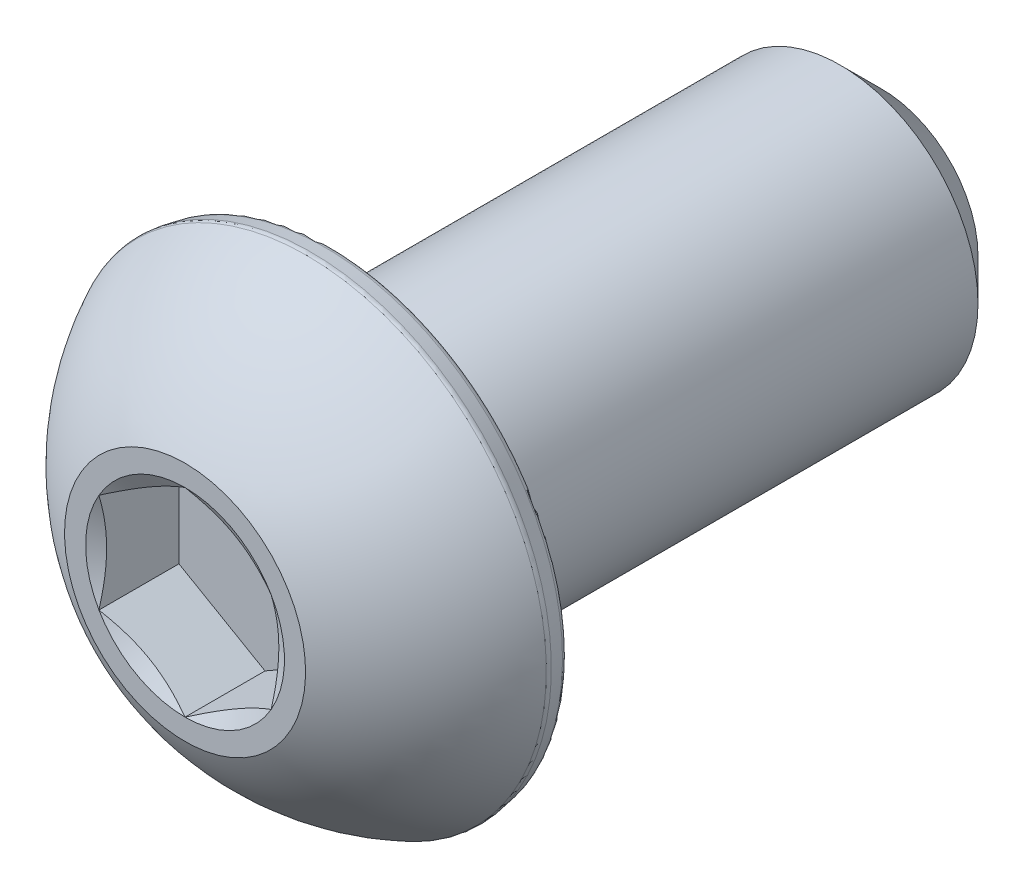
ISO-10303-21;
HEADER;
FILE_DESCRIPTION(('STEP AP214'),'2;1');
FILE_NAME('part.step','',(''),(''),'','','');
FILE_SCHEMA(('AUTOMOTIVE_DESIGN { 1 0 10303 214 1 1 1 1 }'));
ENDSEC;
DATA;
#1=APPLICATION_CONTEXT('core data for automotive mechanical design processes');
#2=APPLICATION_PROTOCOL_DEFINITION('international standard','automotive_design',2000,#1);
#3=PRODUCT_CONTEXT('',#1,'mechanical');
#4=PRODUCT('Part','Part','',(#3));
#5=PRODUCT_RELATED_PRODUCT_CATEGORY('part','',(#4));
#6=PRODUCT_DEFINITION_FORMATION('','',#4);
#7=PRODUCT_DEFINITION_CONTEXT('part definition',#1,'design');
#8=PRODUCT_DEFINITION('design','',#6,#7);
#9=PRODUCT_DEFINITION_SHAPE('','',#8);
#10=(LENGTH_UNIT() NAMED_UNIT(*) SI_UNIT(.MILLI.,.METRE.));
#11=(NAMED_UNIT(*) PLANE_ANGLE_UNIT() SI_UNIT($,.RADIAN.));
#12=(NAMED_UNIT(*) SI_UNIT($,.STERADIAN.) SOLID_ANGLE_UNIT());
#13=UNCERTAINTY_MEASURE_WITH_UNIT(LENGTH_MEASURE(1.E-05),#10,'distance_accuracy_value','');
#14=(GEOMETRIC_REPRESENTATION_CONTEXT(3) GLOBAL_UNCERTAINTY_ASSIGNED_CONTEXT((#13)) GLOBAL_UNIT_ASSIGNED_CONTEXT((#10,
#11,#12)) REPRESENTATION_CONTEXT('',''));
#15=CARTESIAN_POINT('',(0.,0.,0.));
#16=DIRECTION('',(0.,0.,1.));
#17=DIRECTION('',(1.,0.,0.));
#18=AXIS2_PLACEMENT_3D('',#15,#16,#17);
#19=CARTESIAN_POINT('',(0.,0.,8.0264));
#20=DIRECTION('',(0.,0.,-1.));
#21=DIRECTION('',(-1.,0.,0.));
#22=AXIS2_PLACEMENT_3D('',#19,#20,#21);
#23=PLANE('',#22);
#24=CARTESIAN_POINT('',(0.,0.,8.0264));
#25=DIRECTION('',(0.,0.,1.));
#26=DIRECTION('',(1.,0.,0.));
#27=AXIS2_PLACEMENT_3D('',#24,#25,#26);
#28=CIRCLE('',#27,2.29135888084633);
#29=CARTESIAN_POINT('',(-1.984375,1.14567944042316,8.0264));
#30=VERTEX_POINT('',#29);
#31=CARTESIAN_POINT('',(-1.984375,-1.14567944042316,8.0264));
#32=VERTEX_POINT('',#31);
#33=EDGE_CURVE('E91',#30,#32,#28,.T.);
#34=ORIENTED_EDGE('',*,*,#33,.F.);
#35=CARTESIAN_POINT('',(0.,2.29135888084633,8.0264));
#36=VERTEX_POINT('',#35);
#37=EDGE_CURVE('E99',#36,#30,#28,.T.);
#38=ORIENTED_EDGE('',*,*,#37,.F.);
#39=CARTESIAN_POINT('',(1.984375,1.14567944042316,8.0264));
#40=VERTEX_POINT('',#39);
#41=EDGE_CURVE('E51',#40,#36,#28,.T.);
#42=ORIENTED_EDGE('',*,*,#41,.F.);
#43=CARTESIAN_POINT('',(1.984375,-1.14567944042316,8.0264));
#44=VERTEX_POINT('',#43);
#45=EDGE_CURVE('E59',#44,#40,#28,.T.);
#46=ORIENTED_EDGE('',*,*,#45,.F.);
#47=CARTESIAN_POINT('',(0.,-2.29135888084633,8.0264));
#48=VERTEX_POINT('',#47);
#49=EDGE_CURVE('E133',#48,#44,#28,.T.);
#50=ORIENTED_EDGE('',*,*,#49,.F.);
#51=EDGE_CURVE('E103',#32,#48,#28,.T.);
#52=ORIENTED_EDGE('',*,*,#51,.F.);
#53=EDGE_LOOP('',(#34,#38,#42,#46,#50,#52));
#54=FACE_BOUND('',#53,.T.);
#55=CARTESIAN_POINT('',(0.,0.,8.0264));
#56=DIRECTION('',(0.,0.,1.));
#57=DIRECTION('',(1.,0.,0.));
#58=AXIS2_PLACEMENT_3D('',#55,#56,#57);
#59=CIRCLE('',#58,2.778125);
#60=CARTESIAN_POINT('',(0.,2.778125,8.0264));
#61=VERTEX_POINT('',#60);
#62=EDGE_CURVE('E115',#61,#61,#59,.T.);
#63=ORIENTED_EDGE('',*,*,#62,.T.);
#64=EDGE_LOOP('',(#63));
#65=FACE_BOUND('',#64,.T.);
#66=ADVANCED_FACE('F40',(#54,#65),#23,.F.);
#67=CARTESIAN_POINT('',(0.,0.,2.55156816343582));
#68=DIRECTION('',(0.,0.,1.));
#69=DIRECTION('',(0.,1.,0.));
#70=AXIS2_PLACEMENT_3D('',#67,#68,#69);
#71=SPHERICAL_SURFACE('',#70,6.13936170577053);
#72=CARTESIAN_POINT('',(0.,0.,5.22569876785228));
#73=DIRECTION('',(0.,0.,-1.));
#74=DIRECTION('',(-1.,0.,0.));
#75=AXIS2_PLACEMENT_3D('',#72,#73,#74);
#76=CIRCLE('',#75,5.52637201650458);
#77=CARTESIAN_POINT('',(0.,5.52637201650459,5.22569876785228));
#78=VERTEX_POINT('',#77);
#79=EDGE_CURVE('E111',#78,#78,#76,.F.);
#80=CARTESIAN_POINT('',(0.,5.52637201650459,5.22569876785228));
#81=CARTESIAN_POINT('',(0.,5.50825080177498,5.26314830718222));
#82=CARTESIAN_POINT('',(0.,5.48974881162673,5.30041359240028));
#83=CARTESIAN_POINT('',(0.,5.45199117255904,5.37456037887531));
#84=CARTESIAN_POINT('',(0.,5.4327355236396,5.41144188013228));
#85=CARTESIAN_POINT('',(0.,5.3934784590956,5.4848058229478));
#86=CARTESIAN_POINT('',(0.,5.37347704347105,5.52128826450635));
#87=CARTESIAN_POINT('',(0.,5.3327367292478,5.59383901960831));
#88=CARTESIAN_POINT('',(0.,5.3119978306491,5.62990733315172));
#89=CARTESIAN_POINT('',(0.,5.26979111662966,5.70161492366804));
#90=CARTESIAN_POINT('',(0.,5.24832330120893,5.73725420064096));
#91=CARTESIAN_POINT('',(0.,5.20466762693298,5.80808898982251));
#92=CARTESIAN_POINT('',(0.,5.18247976807777,5.84328450203115));
#93=CARTESIAN_POINT('',(0.,5.13739317629116,5.91321721606987));
#94=CARTESIAN_POINT('',(0.,5.11449444335976,5.94795441789995));
#95=CARTESIAN_POINT('',(0.,5.06799556699607,6.01695615519478));
#96=CARTESIAN_POINT('',(0.,5.04439542356378,6.05122069065953));
#97=CARTESIAN_POINT('',(0.,4.9965034795341,6.11926293451963));
#98=CARTESIAN_POINT('',(0.,4.9722116789367,6.15304064291498));
#99=CARTESIAN_POINT('',(0.,4.92294645978839,6.22009527314162));
#100=CARTESIAN_POINT('',(0.,4.89797304123748,6.25337219497291));
#101=CARTESIAN_POINT('',(0.,4.84735490708144,6.31941149953536));
#102=CARTESIAN_POINT('',(0.,4.82171019147631,6.35217388226653));
#103=CARTESIAN_POINT('',(0.,4.76976006154395,6.41717056874016));
#104=CARTESIAN_POINT('',(0.,4.74345464721672,6.44940487248263));
#105=CARTESIAN_POINT('',(0.,4.69019399122223,6.5133320793321));
#106=CARTESIAN_POINT('',(0.,4.66323874955498,6.5450249824391));
#107=CARTESIAN_POINT('',(0.,4.60868957882039,6.60785629011853));
#108=CARTESIAN_POINT('',(0.,4.58109564975306,6.63899469469096));
#109=CARTESIAN_POINT('',(0.,4.52528050811203,6.70070413656277));
#110=CARTESIAN_POINT('',(0.,4.49705929553834,6.73127517386215));
#111=CARTESIAN_POINT('',(0.,4.44000125001922,6.79183724692836));
#112=CARTESIAN_POINT('',(0.,4.41116441707378,6.82182828269518));
#113=CARTESIAN_POINT('',(0.,4.35288704836658,6.88121795813715));
#114=CARTESIAN_POINT('',(0.,4.32344651260481,6.91061659781231));
#115=CARTESIAN_POINT('',(0.,4.2639739053159,6.96880933133461));
#116=CARTESIAN_POINT('',(0.,4.23394183378876,6.99760342518176));
#117=CARTESIAN_POINT('',(0.,4.17329856648729,7.05457516715566));
#118=CARTESIAN_POINT('',(0.,4.14268737071296,7.08275281528242));
#119=CARTESIAN_POINT('',(0.,4.08089850577313,7.13848002068504));
#120=CARTESIAN_POINT('',(0.,4.04972083660764,7.16602957796091));
#121=CARTESIAN_POINT('',(0.,3.98681190985103,7.22048921610578));
#122=CARTESIAN_POINT('',(0.,3.95508065225992,7.24739929697477));
#123=CARTESIAN_POINT('',(0.,3.89107766240224,7.30056886102995));
#124=CARTESIAN_POINT('',(0.,3.85880593013566,7.32682834421614));
#125=CARTESIAN_POINT('',(0.,3.79373532804181,7.37868586050525));
#126=CARTESIAN_POINT('',(0.,3.76093645821453,7.40428389360817));
#127=CARTESIAN_POINT('',(0.,3.69482513596822,7.45480793069356));
#128=CARTESIAN_POINT('',(0.,3.66151268354918,7.47973393467603));
#129=CARTESIAN_POINT('',(0.,3.59438796333499,7.5289036122083));
#130=CARTESIAN_POINT('',(0.,3.56057569553984,7.55314728575809));
#131=CARTESIAN_POINT('',(0.,3.49246531836684,7.60094228313378));
#132=CARTESIAN_POINT('',(0.,3.45816720898899,7.62449360695967));
#133=CARTESIAN_POINT('',(0.,3.3890993231695,7.67089417161335));
#134=CARTESIAN_POINT('',(0.,3.35432954672787,7.69374341244114));
#135=CARTESIAN_POINT('',(0.,3.28433269645534,7.73873036840404));
#136=CARTESIAN_POINT('',(0.,3.24910562262445,7.76086808353916));
#137=CARTESIAN_POINT('',(0.,3.17820873538992,7.80442283788848));
#138=CARTESIAN_POINT('',(0.,3.14253892198629,7.82583987710268));
#139=CARTESIAN_POINT('',(0.,3.0707712995602,7.86794443315283));
#140=CARTESIAN_POINT('',(0.,3.03467349053775,7.88863194998878));
#141=CARTESIAN_POINT('',(0.,2.96206478589977,7.92926889417562));
#142=CARTESIAN_POINT('',(0.,2.92555389028424,7.94921832152651));
#143=CARTESIAN_POINT('',(0.,2.85213413627351,7.98837090731014));
#144=CARTESIAN_POINT('',(0.,2.81522527787832,8.00757406574288));
#145=CARTESIAN_POINT('',(0.,2.778125,8.0264));
#146=B_SPLINE_CURVE_WITH_KNOTS('',3,(#80,#81,#82,#83,#84,#85,#86,#87,#88,#89,#90,#91,#92,#93,
#94,#95,#96,#97,#98,#99,#100,#101,#102,#103,#104,#105,#106,#107,#108,#109,#110,#111,#112,#113,
#114,#115,#116,#117,#118,#119,#120,#121,#122,#123,#124,#125,#126,#127,#128,#129,#130,#131,#132,
#133,#134,#135,#136,#137,#138,#139,#140,#141,#142,#143,#144,#145),.UNSPECIFIED.,.F.,.F.,(4,2,2,
2,2,2,2,2,2,2,2,2,2,2,2,2,2,2,2,2,2,2,2,2,2,2,2,2,2,2,2,2,4),(0.,0.124808174209304,
0.249616348418608,0.374424522627912,0.499232696837217,0.624040871046521,0.748849045255825,
0.873657219465129,0.998465393674433,1.12327356788374,1.24808174209304,1.37288991630235,
1.49769809051165,1.62250626472095,1.74731443893026,1.87212261313956,1.99693078734887,
2.12173896155817,2.24654713576747,2.37135530997678,2.49616348418608,2.62097165839539,
2.74577983260469,2.870588006814,2.9953961810233,3.1202043552326,3.24501252944191,
3.36982070365121,3.49462887786052,3.61943705206982,3.74424522627913,3.86905340048843,
3.99386157469773),.UNSPECIFIED.);
#147=EDGE_CURVE('BSEAM207',#78,#61,#146,.T.);
#148=ORIENTED_EDGE('',*,*,#79,.T.);
#149=ORIENTED_EDGE('',*,*,#62,.F.);
#150=ORIENTED_EDGE('',*,*,#147,.T.);
#151=ORIENTED_EDGE('',*,*,#147,.F.);
#152=EDGE_LOOP('',(#148,#150,#149,#151));
#153=FACE_BOUND('',#152,.T.);
#154=ADVANCED_FACE('F207',(#153),#71,.T.);
#155=CARTESIAN_POINT('',(0.,0.,4.6736));
#156=DIRECTION('',(0.,0.,1.));
#157=DIRECTION('',(1.,0.,0.));
#158=AXIS2_PLACEMENT_3D('',#155,#156,#157);
#159=CONICAL_SURFACE('',#158,5.4612216348621,0.174532925199434);
#160=CARTESIAN_POINT('',(0.,0.,5.12356919154108));
#161=DIRECTION('',(0.,0.,-1.));
#162=DIRECTION('',(-1.,0.,0.));
#163=AXIS2_PLACEMENT_3D('',#160,#161,#162);
#164=CIRCLE('',#163,5.54056334381837);
#165=CARTESIAN_POINT('',(-5.54056334381837,0.,5.12356919154108));
#166=VERTEX_POINT('',#165);
#167=EDGE_CURVE('E44',#166,#166,#164,.T.);
#168=ORIENTED_EDGE('',*,*,#167,.T.);
#169=EDGE_LOOP('',(#168));
#170=FACE_BOUND('',#169,.T.);
#171=CARTESIAN_POINT('',(0.,0.,4.81212961949592));
#172=DIRECTION('',(0.,0.,-1.));
#173=DIRECTION('',(-1.,0.,0.));
#174=AXIS2_PLACEMENT_3D('',#171,#172,#173);
#175=CIRCLE('',#174,5.48564814440651);
#176=CARTESIAN_POINT('',(-5.48564814440651,0.,4.81212961949592));
#177=VERTEX_POINT('',#176);
#178=EDGE_CURVE('E233',#177,#177,#175,.F.);
#179=ORIENTED_EDGE('',*,*,#178,.T.);
#180=EDGE_LOOP('',(#179));
#181=FACE_BOUND('',#180,.T.);
#182=ADVANCED_FACE('F214',(#170,#181),#159,.T.);
#183=CARTESIAN_POINT('',(0.,5.4612216348621,4.6736));
#184=DIRECTION('',(0.,0.,1.));
#185=DIRECTION('',(1.,0.,0.));
#186=AXIS2_PLACEMENT_3D('',#183,#184,#185);
#187=PLANE('',#186);
#188=CARTESIAN_POINT('',(0.,0.,4.6736));
#189=DIRECTION('',(0.,0.,1.));
#190=DIRECTION('',(1.,0.,0.));
#191=AXIS2_PLACEMENT_3D('',#188,#189,#190);
#192=CIRCLE('',#191,5.32055497269154);
#193=CARTESIAN_POINT('',(5.32055497269154,0.,4.6736));
#194=VERTEX_POINT('',#193);
#195=EDGE_CURVE('E11',#194,#194,#192,.F.);
#196=ORIENTED_EDGE('',*,*,#195,.T.);
#197=EDGE_LOOP('',(#196));
#198=FACE_BOUND('',#197,.T.);
#199=CARTESIAN_POINT('',(0.,0.,4.6736));
#200=DIRECTION('',(0.,0.,1.));
#201=DIRECTION('',(1.,0.,0.));
#202=AXIS2_PLACEMENT_3D('',#199,#200,#201);
#203=CIRCLE('',#202,3.175);
#204=CARTESIAN_POINT('',(3.175,0.,4.6736));
#205=VERTEX_POINT('',#204);
#206=EDGE_CURVE('E295',#205,#205,#203,.T.);
#207=ORIENTED_EDGE('',*,*,#206,.T.);
#208=EDGE_LOOP('',(#207));
#209=FACE_BOUND('',#208,.T.);
#210=ADVANCED_FACE('F240',(#198,#209),#187,.F.);
#211=CARTESIAN_POINT('',(0.,0.,8.0264));
#212=DIRECTION('',(0.,0.,1.));
#213=DIRECTION('',(1.,0.,0.));
#214=AXIS2_PLACEMENT_3D('',#211,#212,#213);
#215=CYLINDRICAL_SURFACE('',#214,3.175);
#216=ORIENTED_EDGE('',*,*,#206,.F.);
#217=EDGE_LOOP('',(#216));
#218=FACE_BOUND('',#217,.T.);
#219=CARTESIAN_POINT('',(0.,0.,-7.07389999999999));
#220=DIRECTION('',(0.,0.,1.));
#221=DIRECTION('',(1.,0.,0.));
#222=AXIS2_PLACEMENT_3D('',#219,#220,#221);
#223=CIRCLE('',#222,3.175);
#224=CARTESIAN_POINT('',(3.175,0.,-7.07389999999999));
#225=VERTEX_POINT('',#224);
#226=EDGE_CURVE('E293',#225,#225,#223,.T.);
#227=ORIENTED_EDGE('',*,*,#226,.T.);
#228=EDGE_LOOP('',(#227));
#229=FACE_BOUND('',#228,.T.);
#230=ADVANCED_FACE('F245',(#218,#229),#215,.T.);
#231=CARTESIAN_POINT('',(0.,0.,-8.0264));
#232=DIRECTION('',(0.,0.,1.));
#233=DIRECTION('',(1.,0.,0.));
#234=AXIS2_PLACEMENT_3D('',#231,#232,#233);
#235=CONICAL_SURFACE('',#234,2.2225,0.785398163397443);
#236=ORIENTED_EDGE('',*,*,#226,.F.);
#237=EDGE_LOOP('',(#236));
#238=FACE_BOUND('',#237,.T.);
#239=CARTESIAN_POINT('',(0.,0.,-8.0264));
#240=DIRECTION('',(0.,0.,1.));
#241=DIRECTION('',(1.,0.,0.));
#242=AXIS2_PLACEMENT_3D('',#239,#240,#241);
#243=CIRCLE('',#242,2.2225);
#244=CARTESIAN_POINT('',(2.2225,0.,-8.0264));
#245=VERTEX_POINT('',#244);
#246=EDGE_CURVE('E276',#245,#245,#243,.T.);
#247=ORIENTED_EDGE('',*,*,#246,.T.);
#248=EDGE_LOOP('',(#247));
#249=FACE_BOUND('',#248,.T.);
#250=ADVANCED_FACE('F247',(#238,#249),#235,.T.);
#251=CARTESIAN_POINT('',(0.,0.,-8.0264));
#252=DIRECTION('',(0.,0.,1.));
#253=DIRECTION('',(1.,0.,0.));
#254=AXIS2_PLACEMENT_3D('',#251,#252,#253);
#255=PLANE('',#254);
#256=ORIENTED_EDGE('',*,*,#246,.F.);
#257=EDGE_LOOP('',(#256));
#258=FACE_BOUND('',#257,.T.);
#259=ADVANCED_FACE('F255',(#258),#255,.F.);
#260=CARTESIAN_POINT('',(0.,0.,8.0264));
#261=DIRECTION('',(0.,0.,1.));
#262=DIRECTION('',(1.,0.,0.));
#263=AXIS2_PLACEMENT_3D('',#260,#261,#262);
#264=CONICAL_SURFACE('',#263,2.29135888084633,1.0471975511966);
#265=ORIENTED_EDGE('',*,*,#51,.T.);
#266=CARTESIAN_POINT('',(-1.984575,-1.14556397036933,8.02646667170578));
#267=CARTESIAN_POINT('',(-1.89737036121932,-1.19591159204393,7.99738568224019));
#268=CARTESIAN_POINT('',(-1.809412980695,-1.24669380936686,7.97093720802705));
#269=CARTESIAN_POINT('',(-1.63197502132768,-1.34913766297205,7.92477027120647));
#270=CARTESIAN_POINT('',(-1.54249128874368,-1.40080112006751,7.90506814224896));
#271=CARTESIAN_POINT('',(-1.36463285198753,-1.50348773640632,7.87439773193153));
#272=CARTESIAN_POINT('',(-1.27628551969391,-1.55449509248823,7.86322534272021));
#273=CARTESIAN_POINT('',(-1.09917497188905,-1.65674991493968,7.84988579605442));
#274=CARTESIAN_POINT('',(-1.01041240048945,-1.70799700943121,7.84770759446012));
#275=CARTESIAN_POINT('',(-0.844542697135338,-1.80376192731311,7.85222955150835));
#276=CARTESIAN_POINT('',(-0.767410784334093,-1.84829405793202,7.85781941345587));
#277=CARTESIAN_POINT('',(-0.613649492810919,-1.93706818098387,7.87553893389701));
#278=CARTESIAN_POINT('',(-0.537020646254476,-1.98130986617092,7.88767465032952));
#279=CARTESIAN_POINT('',(-0.382942111493217,-2.07026714969167,7.91801415884436));
#280=CARTESIAN_POINT('',(-0.305511932787317,-2.11497148421093,7.93634660929099));
#281=CARTESIAN_POINT('',(-0.151806688756412,-2.20371324822803,7.97795450640018));
#282=CARTESIAN_POINT('',(-0.0755296529470675,-2.24775181538554,8.00122017128238));
#283=CARTESIAN_POINT('',(0.000200000000000533,-2.29147435090016,8.02646667170578));
#284=B_SPLINE_CURVE_WITH_KNOTS('',3,(#266,#267,#268,#269,#270,#271,#272,#273,#274,#275,#276,
#277,#278,#279,#280,#281,#282,#283),.UNSPECIFIED.,.F.,.F.,(4,2,2,2,2,2,2,2,4),(0.,
0.314555137114086,0.629866549668807,0.937373439505933,1.24450262309398,1.51196650590478,
1.77967834211415,2.05332989762155,2.32644383656793),.UNSPECIFIED.);
#285=EDGE_CURVE('E106',#32,#48,#284,.T.);
#286=ORIENTED_EDGE('',*,*,#285,.F.);
#287=EDGE_LOOP('',(#265,#286));
#288=FACE_BOUND('',#287,.T.);
#289=ADVANCED_FACE('F110',(#288),#264,.F.);
#290=ORIENTED_EDGE('',*,*,#49,.T.);
#291=CARTESIAN_POINT('',(-0.000199999999999445,-2.29147435090017,8.02646667170578));
#292=CARTESIAN_POINT('',(0.0870046387806774,-2.24112672922556,7.99738568224019));
#293=CARTESIAN_POINT('',(0.174962019304997,-2.19034451190263,7.97093720802705));
#294=CARTESIAN_POINT('',(0.352399978672321,-2.08790065829744,7.92477027120647));
#295=CARTESIAN_POINT('',(0.44188371125632,-2.03623720120198,7.90506814224896));
#296=CARTESIAN_POINT('',(0.619742148012469,-1.93355058486317,7.87439773193153));
#297=CARTESIAN_POINT('',(0.708089480306094,-1.88254322878126,7.86322534272021));
#298=CARTESIAN_POINT('',(0.88520002811095,-1.78028840632981,7.84988579605442));
#299=CARTESIAN_POINT('',(0.973962599510547,-1.72904131183829,7.84770759446012));
#300=CARTESIAN_POINT('',(1.13983230286466,-1.63327639395638,7.85222955150835));
#301=CARTESIAN_POINT('',(1.21696421566591,-1.58874426333747,7.85781941345587));
#302=CARTESIAN_POINT('',(1.37072550718908,-1.49997014028562,7.87553893389701));
#303=CARTESIAN_POINT('',(1.44735435374552,-1.45572845509857,7.88767465032952));
#304=CARTESIAN_POINT('',(1.60143288850678,-1.36677117157782,7.91801415884436));
#305=CARTESIAN_POINT('',(1.67886306721268,-1.32206683705856,7.93634660929099));
#306=CARTESIAN_POINT('',(1.83256831124359,-1.23332507304146,7.97795450640018));
#307=CARTESIAN_POINT('',(1.90884534705293,-1.18928650588395,8.00122017128238));
#308=CARTESIAN_POINT('',(1.984575,-1.14556397036933,8.02646667170578));
#309=B_SPLINE_CURVE_WITH_KNOTS('',3,(#291,#292,#293,#294,#295,#296,#297,#298,#299,#300,#301,
#302,#303,#304,#305,#306,#307,#308),.UNSPECIFIED.,.F.,.F.,(4,2,2,2,2,2,2,2,4),(0.,
0.314555137114086,0.629866549668807,0.937373439505933,1.24450262309398,1.51196650590478,
1.77967834211415,2.05332989762155,2.32644383656793),.UNSPECIFIED.);
#310=EDGE_CURVE('E134',#48,#44,#309,.T.);
#311=ORIENTED_EDGE('',*,*,#310,.F.);
#312=EDGE_LOOP('',(#290,#311));
#313=FACE_BOUND('',#312,.T.);
#314=ADVANCED_FACE('F318',(#313),#264,.F.);
#315=ORIENTED_EDGE('',*,*,#45,.T.);
#316=CARTESIAN_POINT('',(1.984375,-2.96692860034506,8.76426065109237));
#317=CARTESIAN_POINT('',(1.984375,-2.88123645369666,8.72314880177529));
#318=CARTESIAN_POINT('',(1.984375,-2.79533554929687,8.68246397295606));
#319=CARTESIAN_POINT('',(1.984375,-2.62300496253372,8.60219059794519));
#320=CARTESIAN_POINT('',(1.984375,-2.53657518838115,8.56260224904708));
#321=CARTESIAN_POINT('',(1.984375,-2.36258003650985,8.4845429144296));
#322=CARTESIAN_POINT('',(1.984375,-2.27501095051754,8.44608016339895));
#323=CARTESIAN_POINT('',(1.984375,-2.09913795632987,8.37087942709752));
#324=CARTESIAN_POINT('',(1.984375,-2.01083408662377,8.33414135214644));
#325=CARTESIAN_POINT('',(1.984375,-1.83102497893539,8.26191372935496));
#326=CARTESIAN_POINT('',(1.984375,-1.73949640320228,8.22648193907389));
#327=CARTESIAN_POINT('',(1.984375,-1.55533214713673,8.15856418355678));
#328=CARTESIAN_POINT('',(1.984375,-1.46269633980311,8.12607855999264));
#329=CARTESIAN_POINT('',(1.984375,-1.27638419434465,8.06498213635921));
#330=CARTESIAN_POINT('',(1.984375,-1.18271082678456,8.0363623752382));
#331=CARTESIAN_POINT('',(1.984375,-0.994021652382585,7.98397636886058));
#332=CARTESIAN_POINT('',(1.984375,-0.89900618522973,7.96020891819845));
#333=CARTESIAN_POINT('',(1.984375,-0.707830512458419,7.91879473938057));
#334=CARTESIAN_POINT('',(1.984375,-0.611673084373238,7.90113544006603));
#335=CARTESIAN_POINT('',(1.984375,-0.418283092113671,7.87309309653349));
#336=CARTESIAN_POINT('',(1.984375,-0.321050601045249,7.86270956060593));
#337=CARTESIAN_POINT('',(1.984375,-0.127210752774482,7.8501852009906));
#338=CARTESIAN_POINT('',(1.984375,-0.0306098639781226,7.84794710736856));
#339=CARTESIAN_POINT('',(1.984375,0.162431915887107,7.85164204703217));
#340=CARTESIAN_POINT('',(1.984375,0.258872796678699,7.85757558627506));
#341=CARTESIAN_POINT('',(1.984375,0.496826477184735,7.88177557369152));
#342=CARTESIAN_POINT('',(1.984375,0.637878211825128,7.90457722021417));
#343=CARTESIAN_POINT('',(1.984375,0.917238703702529,7.96337602426136));
#344=CARTESIAN_POINT('',(1.984375,1.05554394232965,7.99938908554252));
#345=CARTESIAN_POINT('',(1.984375,1.26239464896717,8.06090820789035));
#346=CARTESIAN_POINT('',(1.984375,1.33200934564274,8.08295142641455));
#347=CARTESIAN_POINT('',(1.984375,1.47051409380588,8.1290769862575));
#348=CARTESIAN_POINT('',(1.984375,1.53940456776433,8.15315805500612));
#349=CARTESIAN_POINT('',(1.984375,1.67655293465251,8.20300958868946));
#350=CARTESIAN_POINT('',(1.984375,1.74481093998431,8.22877974660229));
#351=CARTESIAN_POINT('',(1.984375,1.88078910071683,8.28173071268156));
#352=CARTESIAN_POINT('',(1.984375,1.94850916300286,8.30891175918296));
#353=CARTESIAN_POINT('',(1.984375,2.12136731788458,8.38003362383593));
#354=CARTESIAN_POINT('',(1.984375,2.22615977384557,8.42481359670133));
#355=CARTESIAN_POINT('',(1.984375,2.43479837304527,8.51653219568247));
#356=CARTESIAN_POINT('',(1.984375,2.5386444446916,8.56347098351126));
#357=CARTESIAN_POINT('',(1.984375,2.84907841644385,8.70676456132352));
#358=CARTESIAN_POINT('',(1.984375,3.05452739791262,8.80558187526435));
#359=CARTESIAN_POINT('',(1.984375,3.46367014223902,9.00736088572476));
#360=CARTESIAN_POINT('',(1.984375,3.66736143684958,9.11032752775298));
#361=CARTESIAN_POINT('',(1.984375,4.0733484486621,9.31890841655482));
#362=CARTESIAN_POINT('',(1.984375,4.27564433912762,9.42452232679349));
#363=CARTESIAN_POINT('',(1.984375,4.66022184962415,9.62751933686161));
#364=CARTESIAN_POINT('',(1.984375,4.84259034249047,9.72473842729249));
#365=CARTESIAN_POINT('',(1.984375,5.20674070245669,9.92028432048827));
#366=CARTESIAN_POINT('',(1.984375,5.38852254752481,10.0186111642466));
#367=CARTESIAN_POINT('',(1.984375,5.75117247931181,10.215843617507));
#368=CARTESIAN_POINT('',(1.984375,5.93204171415673,10.3147471187779));
#369=CARTESIAN_POINT('',(1.984375,6.29341450955435,10.5131978398903));
#370=CARTESIAN_POINT('',(1.984375,6.47391808874828,10.6127450257738));
#371=CARTESIAN_POINT('',(1.984375,6.6542902961452,10.7125282522634));
#372=B_SPLINE_CURVE_WITH_KNOTS('',3,(#316,#317,#318,#319,#320,#321,#322,#323,#324,#325,#326,
#327,#328,#329,#330,#331,#332,#333,#334,#335,#336,#337,#338,#339,#340,#341,#342,#343,#344,#345,
#346,#347,#348,#349,#350,#351,#352,#353,#354,#355,#356,#357,#358,#359,#360,#361,#362,#363,#364,
#365,#366,#367,#368,#369,#370,#371),.UNSPECIFIED.,.F.,.F.,(4,2,2,2,2,2,2,2,2,2,2,2,2,2,2,2,2,2,
2,2,2,2,2,2,2,2,2,4),(0.,0.285135519832372,0.570322016122786,0.857238463819791,1.14413997577449,
1.43854271801315,1.7329795590899,2.02672173491208,2.32039085060263,2.61345191984504,
2.90649318156652,3.19602335108128,3.48557144803805,3.91334047285798,4.34162614021154,
4.56066589824458,4.77956986852721,4.99843415889189,5.21733554208811,5.55917796423187,
5.90104603503021,6.58489509249957,7.26958483186156,7.95418796687477,8.57417425374277,
9.1941835596094,9.81261585701217,10.431015790458),.UNSPECIFIED.);
#373=EDGE_CURVE('E144',#44,#40,#372,.T.);
#374=ORIENTED_EDGE('',*,*,#373,.F.);
#375=EDGE_LOOP('',(#315,#374));
#376=FACE_BOUND('',#375,.T.);
#377=ADVANCED_FACE('F317',(#376),#264,.F.);
#378=ORIENTED_EDGE('',*,*,#41,.T.);
#379=CARTESIAN_POINT('',(1.984575,1.14556397036933,8.02646667170578));
#380=CARTESIAN_POINT('',(1.89737036121932,1.19591159204393,7.99738568224019));
#381=CARTESIAN_POINT('',(1.809412980695,1.24669380936686,7.97093720802705));
#382=CARTESIAN_POINT('',(1.63197502132768,1.34913766297205,7.92477027120647));
#383=CARTESIAN_POINT('',(1.54249128874368,1.40080112006751,7.90506814224896));
#384=CARTESIAN_POINT('',(1.36463285198753,1.50348773640632,7.87439773193153));
#385=CARTESIAN_POINT('',(1.27628551969391,1.55449509248823,7.86322534272021));
#386=CARTESIAN_POINT('',(1.09917497188905,1.65674991493969,7.84988579605442));
#387=CARTESIAN_POINT('',(1.01041240048945,1.70799700943121,7.84770759446012));
#388=CARTESIAN_POINT('',(0.844542697135338,1.80376192731311,7.85222955150835));
#389=CARTESIAN_POINT('',(0.767410784334093,1.84829405793202,7.85781941345587));
#390=CARTESIAN_POINT('',(0.613649492810919,1.93706818098387,7.87553893389701));
#391=CARTESIAN_POINT('',(0.537020646254476,1.98130986617092,7.88767465032952));
#392=CARTESIAN_POINT('',(0.382942111493217,2.07026714969168,7.91801415884436));
#393=CARTESIAN_POINT('',(0.305511932787317,2.11497148421093,7.93634660929099));
#394=CARTESIAN_POINT('',(0.151806688756411,2.20371324822803,7.97795450640018));
#395=CARTESIAN_POINT('',(0.0755296529470671,2.24775181538554,8.00122017128238));
#396=CARTESIAN_POINT('',(-0.000200000000000831,2.29147435090017,8.02646667170578));
#397=B_SPLINE_CURVE_WITH_KNOTS('',3,(#379,#380,#381,#382,#383,#384,#385,#386,#387,#388,#389,
#390,#391,#392,#393,#394,#395,#396),.UNSPECIFIED.,.F.,.F.,(4,2,2,2,2,2,2,2,4),(0.,
0.314555137114086,0.629866549668807,0.937373439505933,1.24450262309398,1.51196650590478,
1.77967834211415,2.05332989762155,2.32644383656793),.UNSPECIFIED.);
#398=EDGE_CURVE('E171',#40,#36,#397,.T.);
#399=ORIENTED_EDGE('',*,*,#398,.F.);
#400=EDGE_LOOP('',(#378,#399));
#401=FACE_BOUND('',#400,.T.);
#402=ADVANCED_FACE('F315',(#401),#264,.F.);
#403=ORIENTED_EDGE('',*,*,#37,.T.);
#404=CARTESIAN_POINT('',(0.000199999999999225,2.29147435090017,8.02646667170578));
#405=CARTESIAN_POINT('',(-0.0870046387806773,2.24112672922556,7.99738568224019));
#406=CARTESIAN_POINT('',(-0.174962019304997,2.19034451190263,7.97093720802705));
#407=CARTESIAN_POINT('',(-0.352399978672321,2.08790065829745,7.92477027120647));
#408=CARTESIAN_POINT('',(-0.44188371125632,2.03623720120198,7.90506814224896));
#409=CARTESIAN_POINT('',(-0.619742148012469,1.93355058486317,7.87439773193153));
#410=CARTESIAN_POINT('',(-0.708089480306094,1.88254322878126,7.86322534272021));
#411=CARTESIAN_POINT('',(-0.885200028110951,1.78028840632981,7.84988579605442));
#412=CARTESIAN_POINT('',(-0.973962599510548,1.72904131183829,7.84770759446012));
#413=CARTESIAN_POINT('',(-1.13983230286466,1.63327639395638,7.85222955150835));
#414=CARTESIAN_POINT('',(-1.21696421566591,1.58874426333747,7.85781941345587));
#415=CARTESIAN_POINT('',(-1.37072550718908,1.49997014028563,7.87553893389701));
#416=CARTESIAN_POINT('',(-1.44735435374552,1.45572845509857,7.88767465032952));
#417=CARTESIAN_POINT('',(-1.60143288850678,1.36677117157782,7.91801415884436));
#418=CARTESIAN_POINT('',(-1.67886306721268,1.32206683705856,7.93634660929099));
#419=CARTESIAN_POINT('',(-1.83256831124359,1.23332507304146,7.97795450640018));
#420=CARTESIAN_POINT('',(-1.90884534705293,1.18928650588395,8.00122017128238));
#421=CARTESIAN_POINT('',(-1.984575,1.14556397036933,8.02646667170578));
#422=B_SPLINE_CURVE_WITH_KNOTS('',3,(#404,#405,#406,#407,#408,#409,#410,#411,#412,#413,#414,
#415,#416,#417,#418,#419,#420,#421),.UNSPECIFIED.,.F.,.F.,(4,2,2,2,2,2,2,2,4),(0.,
0.314555137114086,0.629866549668807,0.937373439505933,1.24450262309398,1.51196650590478,
1.77967834211415,2.05332989762155,2.32644383656793),.UNSPECIFIED.);
#423=EDGE_CURVE('E125',#36,#30,#422,.T.);
#424=ORIENTED_EDGE('',*,*,#423,.F.);
#425=EDGE_LOOP('',(#403,#424));
#426=FACE_BOUND('',#425,.T.);
#427=ADVANCED_FACE('F157',(#426),#264,.F.);
#428=ORIENTED_EDGE('',*,*,#33,.T.);
#429=CARTESIAN_POINT('',(-1.984375,-2.96692860034507,8.76426065109238));
#430=CARTESIAN_POINT('',(-1.984375,-2.88123645369667,8.72314880177529));
#431=CARTESIAN_POINT('',(-1.984375,-2.79533554929687,8.68246397295606));
#432=CARTESIAN_POINT('',(-1.984375,-2.62300496253372,8.60219059794519));
#433=CARTESIAN_POINT('',(-1.984375,-2.53657518838115,8.56260224904708));
#434=CARTESIAN_POINT('',(-1.984375,-2.36258003650985,8.4845429144296));
#435=CARTESIAN_POINT('',(-1.984375,-2.27501095051754,8.44608016339895));
#436=CARTESIAN_POINT('',(-1.984375,-2.09913795632987,8.37087942709752));
#437=CARTESIAN_POINT('',(-1.984375,-2.01083408662377,8.33414135214644));
#438=CARTESIAN_POINT('',(-1.984375,-1.83102497893539,8.26191372935496));
#439=CARTESIAN_POINT('',(-1.984375,-1.73949640320228,8.22648193907389));
#440=CARTESIAN_POINT('',(-1.984375,-1.55533214713673,8.15856418355678));
#441=CARTESIAN_POINT('',(-1.984375,-1.46269633980311,8.12607855999264));
#442=CARTESIAN_POINT('',(-1.984375,-1.27638419434466,8.06498213635921));
#443=CARTESIAN_POINT('',(-1.984375,-1.18271082678456,8.0363623752382));
#444=CARTESIAN_POINT('',(-1.984375,-0.994021652382587,7.98397636886058));
#445=CARTESIAN_POINT('',(-1.984375,-0.899006185229732,7.96020891819845));
#446=CARTESIAN_POINT('',(-1.984375,-0.707830512458421,7.91879473938057));
#447=CARTESIAN_POINT('',(-1.984375,-0.611673084373239,7.90113544006603));
#448=CARTESIAN_POINT('',(-1.984375,-0.418283092113672,7.87309309653349));
#449=CARTESIAN_POINT('',(-1.984375,-0.321050601045251,7.86270956060593));
#450=CARTESIAN_POINT('',(-1.984375,-0.127210752774483,7.8501852009906));
#451=CARTESIAN_POINT('',(-1.984375,-0.0306098639781238,7.84794710736856));
#452=CARTESIAN_POINT('',(-1.984375,0.162431915887106,7.85164204703217));
#453=CARTESIAN_POINT('',(-1.984375,0.258872796678698,7.85757558627506));
#454=CARTESIAN_POINT('',(-1.984375,0.496826477184734,7.88177557369152));
#455=CARTESIAN_POINT('',(-1.984375,0.637878211825128,7.90457722021417));
#456=CARTESIAN_POINT('',(-1.984375,0.917238703702529,7.96337602426136));
#457=CARTESIAN_POINT('',(-1.984375,1.05554394232965,7.99938908554252));
#458=CARTESIAN_POINT('',(-1.984375,1.26239464896717,8.06090820789035));
#459=CARTESIAN_POINT('',(-1.984375,1.33200934564274,8.08295142641455));
#460=CARTESIAN_POINT('',(-1.984375,1.47051409380588,8.1290769862575));
#461=CARTESIAN_POINT('',(-1.984375,1.53940456776433,8.15315805500612));
#462=CARTESIAN_POINT('',(-1.984375,1.67655293465251,8.20300958868946));
#463=CARTESIAN_POINT('',(-1.984375,1.74481093998431,8.22877974660228));
#464=CARTESIAN_POINT('',(-1.984375,1.88078910071683,8.28173071268156));
#465=CARTESIAN_POINT('',(-1.984375,1.94850916300286,8.30891175918296));
#466=CARTESIAN_POINT('',(-1.984375,2.12136731788458,8.38003362383593));
#467=CARTESIAN_POINT('',(-1.984375,2.22615977384556,8.42481359670133));
#468=CARTESIAN_POINT('',(-1.984375,2.43479837304527,8.51653219568247));
#469=CARTESIAN_POINT('',(-1.984375,2.5386444446916,8.56347098351126));
#470=CARTESIAN_POINT('',(-1.984375,2.84907841644385,8.70676456132352));
#471=CARTESIAN_POINT('',(-1.984375,3.05452739791262,8.80558187526435));
#472=CARTESIAN_POINT('',(-1.984375,3.46367014223902,9.00736088572476));
#473=CARTESIAN_POINT('',(-1.984375,3.66736143684958,9.11032752775299));
#474=CARTESIAN_POINT('',(-1.984375,4.07334844866211,9.31890841655482));
#475=CARTESIAN_POINT('',(-1.984375,4.27564433912763,9.42452232679349));
#476=CARTESIAN_POINT('',(-1.984375,4.66022184962415,9.62751933686162));
#477=CARTESIAN_POINT('',(-1.984375,4.84259034249047,9.72473842729249));
#478=CARTESIAN_POINT('',(-1.984375,5.20674070245669,9.92028432048827));
#479=CARTESIAN_POINT('',(-1.984375,5.38852254752481,10.0186111642466));
#480=CARTESIAN_POINT('',(-1.984375,5.7511724793118,10.215843617507));
#481=CARTESIAN_POINT('',(-1.984375,5.93204171415673,10.3147471187779));
#482=CARTESIAN_POINT('',(-1.984375,6.29341450955435,10.5131978398903));
#483=CARTESIAN_POINT('',(-1.984375,6.47391808874828,10.6127450257738));
#484=CARTESIAN_POINT('',(-1.984375,6.6542902961452,10.7125282522634));
#485=B_SPLINE_CURVE_WITH_KNOTS('',3,(#429,#430,#431,#432,#433,#434,#435,#436,#437,#438,#439,
#440,#441,#442,#443,#444,#445,#446,#447,#448,#449,#450,#451,#452,#453,#454,#455,#456,#457,#458,
#459,#460,#461,#462,#463,#464,#465,#466,#467,#468,#469,#470,#471,#472,#473,#474,#475,#476,#477,
#478,#479,#480,#481,#482,#483,#484),.UNSPECIFIED.,.F.,.F.,(4,2,2,2,2,2,2,2,2,2,2,2,2,2,2,2,2,2,
2,2,2,2,2,2,2,2,2,4),(0.,0.285135519832373,0.570322016122787,0.857238463819793,1.14413997577449,
1.43854271801315,1.7329795590899,2.02672173491208,2.32039085060263,2.61345191984504,
2.90649318156653,3.19602335108128,3.48557144803805,3.91334047285799,4.34162614021154,
4.56066589824458,4.77956986852721,4.99843415889189,5.21733554208812,5.55917796423187,
5.90104603503021,6.58489509249957,7.26958483186157,7.95418796687477,8.57417425374278,
9.1941835596094,9.81261585701217,10.431015790458),.UNSPECIFIED.);
#486=EDGE_CURVE('E94',#30,#32,#485,.F.);
#487=ORIENTED_EDGE('',*,*,#486,.F.);
#488=EDGE_LOOP('',(#428,#487));
#489=FACE_BOUND('',#488,.T.);
#490=ADVANCED_FACE('F92',(#489),#264,.F.);
#491=CARTESIAN_POINT('',(0.,0.,6.18236));
#492=DIRECTION('',(0.,0.,1.));
#493=DIRECTION('',(1.,0.,0.));
#494=AXIS2_PLACEMENT_3D('',#491,#492,#493);
#495=PLANE('',#494);
#496=DIRECTION('',(0.,-1.,0.));
#497=VECTOR('',#496,1.);
#498=CARTESIAN_POINT('',(-1.984375,1.14567944042316,6.18236));
#499=LINE('',#498,#497);
#500=CARTESIAN_POINT('',(-1.984375,1.14567944042316,6.18236));
#501=VERTEX_POINT('',#500);
#502=CARTESIAN_POINT('',(-1.984375,-1.14567944042316,6.18236));
#503=VERTEX_POINT('',#502);
#504=EDGE_CURVE('E122',#501,#503,#499,.T.);
#505=ORIENTED_EDGE('',*,*,#504,.T.);
#506=DIRECTION('',(0.866025403784439,-0.5,0.));
#507=VECTOR('',#506,1.);
#508=CARTESIAN_POINT('',(-1.984375,-1.14567944042316,6.18236));
#509=LINE('',#508,#507);
#510=CARTESIAN_POINT('',(0.,-2.29135888084633,6.18236));
#511=VERTEX_POINT('',#510);
#512=EDGE_CURVE('E129',#503,#511,#509,.T.);
#513=ORIENTED_EDGE('',*,*,#512,.T.);
#514=DIRECTION('',(0.866025403784438,0.5,0.));
#515=VECTOR('',#514,1.);
#516=CARTESIAN_POINT('',(0.,-2.29135888084633,6.18236));
#517=LINE('',#516,#515);
#518=CARTESIAN_POINT('',(1.984375,-1.14567944042316,6.18236));
#519=VERTEX_POINT('',#518);
#520=EDGE_CURVE('E266',#511,#519,#517,.T.);
#521=ORIENTED_EDGE('',*,*,#520,.T.);
#522=DIRECTION('',(0.,1.,0.));
#523=VECTOR('',#522,1.);
#524=CARTESIAN_POINT('',(1.984375,-1.14567944042316,6.18236));
#525=LINE('',#524,#523);
#526=CARTESIAN_POINT('',(1.984375,1.14567944042316,6.18236));
#527=VERTEX_POINT('',#526);
#528=EDGE_CURVE('E275',#519,#527,#525,.T.);
#529=ORIENTED_EDGE('',*,*,#528,.T.);
#530=DIRECTION('',(-0.866025403784439,0.5,0.));
#531=VECTOR('',#530,1.);
#532=CARTESIAN_POINT('',(1.984375,1.14567944042316,6.18236));
#533=LINE('',#532,#531);
#534=CARTESIAN_POINT('',(0.,2.29135888084633,6.18236));
#535=VERTEX_POINT('',#534);
#536=EDGE_CURVE('E273',#527,#535,#533,.T.);
#537=ORIENTED_EDGE('',*,*,#536,.T.);
#538=DIRECTION('',(-0.866025403784438,-0.5,0.));
#539=VECTOR('',#538,1.);
#540=CARTESIAN_POINT('',(0.,2.29135888084633,6.18236));
#541=LINE('',#540,#539);
#542=EDGE_CURVE('E128',#535,#501,#541,.T.);
#543=ORIENTED_EDGE('',*,*,#542,.T.);
#544=EDGE_LOOP('',(#505,#513,#521,#529,#537,#543));
#545=FACE_BOUND('',#544,.T.);
#546=ADVANCED_FACE('F160',(#545),#495,.T.);
#547=CARTESIAN_POINT('',(-1.984375,-1.14567944042316,6.18236));
#548=DIRECTION('',(-0.5,-0.866025403784439,0.));
#549=DIRECTION('',(0.866025403784439,-0.5,0.));
#550=AXIS2_PLACEMENT_3D('',#547,#548,#549);
#551=PLANE('',#550);
#552=DIRECTION('',(0.,0.,1.));
#553=VECTOR('',#552,1.);
#554=CARTESIAN_POINT('',(-1.984375,-1.14567944042316,6.18236));
#555=LINE('',#554,#553);
#556=EDGE_CURVE('E120',#503,#32,#555,.T.);
#557=ORIENTED_EDGE('',*,*,#556,.T.);
#558=ORIENTED_EDGE('',*,*,#285,.T.);
#559=DIRECTION('',(0.,0.,1.));
#560=VECTOR('',#559,1.);
#561=CARTESIAN_POINT('',(0.,-2.29135888084633,6.18236));
#562=LINE('',#561,#560);
#563=EDGE_CURVE('E130',#511,#48,#562,.T.);
#564=ORIENTED_EDGE('',*,*,#563,.F.);
#565=ORIENTED_EDGE('',*,*,#512,.F.);
#566=EDGE_LOOP('',(#557,#558,#564,#565));
#567=FACE_BOUND('',#566,.T.);
#568=ADVANCED_FACE('F121',(#567),#551,.F.);
#569=CARTESIAN_POINT('',(0.,-2.29135888084633,6.18236));
#570=DIRECTION('',(0.5,-0.866025403784439,0.));
#571=DIRECTION('',(0.866025403784439,0.5,0.));
#572=AXIS2_PLACEMENT_3D('',#569,#570,#571);
#573=PLANE('',#572);
#574=ORIENTED_EDGE('',*,*,#563,.T.);
#575=ORIENTED_EDGE('',*,*,#310,.T.);
#576=DIRECTION('',(0.,0.,1.));
#577=VECTOR('',#576,1.);
#578=CARTESIAN_POINT('',(1.984375,-1.14567944042316,6.18236));
#579=LINE('',#578,#577);
#580=EDGE_CURVE('E286',#519,#44,#579,.T.);
#581=ORIENTED_EDGE('',*,*,#580,.F.);
#582=ORIENTED_EDGE('',*,*,#520,.F.);
#583=EDGE_LOOP('',(#574,#575,#581,#582));
#584=FACE_BOUND('',#583,.T.);
#585=ADVANCED_FACE('F152',(#584),#573,.F.);
#586=CARTESIAN_POINT('',(1.984375,-1.14567944042316,6.18236));
#587=DIRECTION('',(1.,0.,0.));
#588=DIRECTION('',(0.,0.,-1.));
#589=AXIS2_PLACEMENT_3D('',#586,#587,#588);
#590=PLANE('',#589);
#591=ORIENTED_EDGE('',*,*,#580,.T.);
#592=ORIENTED_EDGE('',*,*,#373,.T.);
#593=DIRECTION('',(0.,0.,1.));
#594=VECTOR('',#593,1.);
#595=CARTESIAN_POINT('',(1.984375,1.14567944042316,6.18236));
#596=LINE('',#595,#594);
#597=EDGE_CURVE('E283',#527,#40,#596,.T.);
#598=ORIENTED_EDGE('',*,*,#597,.F.);
#599=ORIENTED_EDGE('',*,*,#528,.F.);
#600=EDGE_LOOP('',(#591,#592,#598,#599));
#601=FACE_BOUND('',#600,.T.);
#602=ADVANCED_FACE('F192',(#601),#590,.F.);
#603=CARTESIAN_POINT('',(1.984375,1.14567944042316,6.18236));
#604=DIRECTION('',(0.5,0.866025403784439,0.));
#605=DIRECTION('',(-0.866025403784439,0.5,0.));
#606=AXIS2_PLACEMENT_3D('',#603,#604,#605);
#607=PLANE('',#606);
#608=ORIENTED_EDGE('',*,*,#597,.T.);
#609=ORIENTED_EDGE('',*,*,#398,.T.);
#610=DIRECTION('',(0.,0.,1.));
#611=VECTOR('',#610,1.);
#612=CARTESIAN_POINT('',(0.,2.29135888084633,6.18236));
#613=LINE('',#612,#611);
#614=EDGE_CURVE('E278',#535,#36,#613,.T.);
#615=ORIENTED_EDGE('',*,*,#614,.F.);
#616=ORIENTED_EDGE('',*,*,#536,.F.);
#617=EDGE_LOOP('',(#608,#609,#615,#616));
#618=FACE_BOUND('',#617,.T.);
#619=ADVANCED_FACE('F194',(#618),#607,.F.);
#620=CARTESIAN_POINT('',(0.,2.29135888084633,6.18236));
#621=DIRECTION('',(-0.5,0.866025403784438,0.));
#622=DIRECTION('',(-0.866025403784439,-0.5,0.));
#623=AXIS2_PLACEMENT_3D('',#620,#621,#622);
#624=PLANE('',#623);
#625=ORIENTED_EDGE('',*,*,#614,.T.);
#626=ORIENTED_EDGE('',*,*,#423,.T.);
#627=DIRECTION('',(0.,0.,1.));
#628=VECTOR('',#627,1.);
#629=CARTESIAN_POINT('',(-1.984375,1.14567944042316,6.18236));
#630=LINE('',#629,#628);
#631=EDGE_CURVE('E118',#501,#30,#630,.T.);
#632=ORIENTED_EDGE('',*,*,#631,.F.);
#633=ORIENTED_EDGE('',*,*,#542,.F.);
#634=EDGE_LOOP('',(#625,#626,#632,#633));
#635=FACE_BOUND('',#634,.T.);
#636=ADVANCED_FACE('F189',(#635),#624,.F.);
#637=CARTESIAN_POINT('',(-1.984375,1.14567944042316,6.18236));
#638=DIRECTION('',(-1.,0.,0.));
#639=DIRECTION('',(0.,-1.,0.));
#640=AXIS2_PLACEMENT_3D('',#637,#638,#639);
#641=PLANE('',#640);
#642=ORIENTED_EDGE('',*,*,#631,.T.);
#643=ORIENTED_EDGE('',*,*,#486,.T.);
#644=ORIENTED_EDGE('',*,*,#556,.F.);
#645=ORIENTED_EDGE('',*,*,#504,.F.);
#646=EDGE_LOOP('',(#642,#643,#644,#645));
#647=FACE_BOUND('',#646,.T.);
#648=ADVANCED_FACE('F114',(#647),#641,.F.);
#649=CARTESIAN_POINT('',(0.,0.,5.15267957204516));
#650=DIRECTION('',(0.,0.,-1.));
#651=DIRECTION('',(-1.,0.,0.));
#652=AXIS2_PLACEMENT_3D('',#649,#650,#651);
#653=TOROIDAL_SURFACE('',#652,5.3754701721034,0.16764);
#654=ORIENTED_EDGE('',*,*,#167,.F.);
#655=EDGE_LOOP('',(#654));
#656=FACE_BOUND('',#655,.T.);
#657=ORIENTED_EDGE('',*,*,#79,.F.);
#658=EDGE_LOOP('',(#657));
#659=FACE_BOUND('',#658,.T.);
#660=ADVANCED_FACE('F220',(#656,#659),#653,.T.);
#661=CARTESIAN_POINT('',(0.,0.,4.84124));
#662=DIRECTION('',(0.,0.,1.));
#663=DIRECTION('',(1.,0.,0.));
#664=AXIS2_PLACEMENT_3D('',#661,#662,#663);
#665=TOROIDAL_SURFACE('',#664,5.32055497269154,0.16764);
#666=ORIENTED_EDGE('',*,*,#195,.F.);
#667=EDGE_LOOP('',(#666));
#668=FACE_BOUND('',#667,.T.);
#669=ORIENTED_EDGE('',*,*,#178,.F.);
#670=EDGE_LOOP('',(#669));
#671=FACE_BOUND('',#670,.T.);
#672=ADVANCED_FACE('F39',(#668,#671),#665,.T.);
#673=CLOSED_SHELL('',(#66,#154,#182,#210,#230,#250,#259,#289,#314,#377,#402,#427,#490,#546,#568,
#585,#602,#619,#636,#648,#660,#672));
#674=MANIFOLD_SOLID_BREP('B2',#673);
#675=ADVANCED_BREP_SHAPE_REPRESENTATION('',(#18,#674),#14);
#676=SHAPE_DEFINITION_REPRESENTATION(#9,#675);
ENDSEC;
END-ISO-10303-21;
